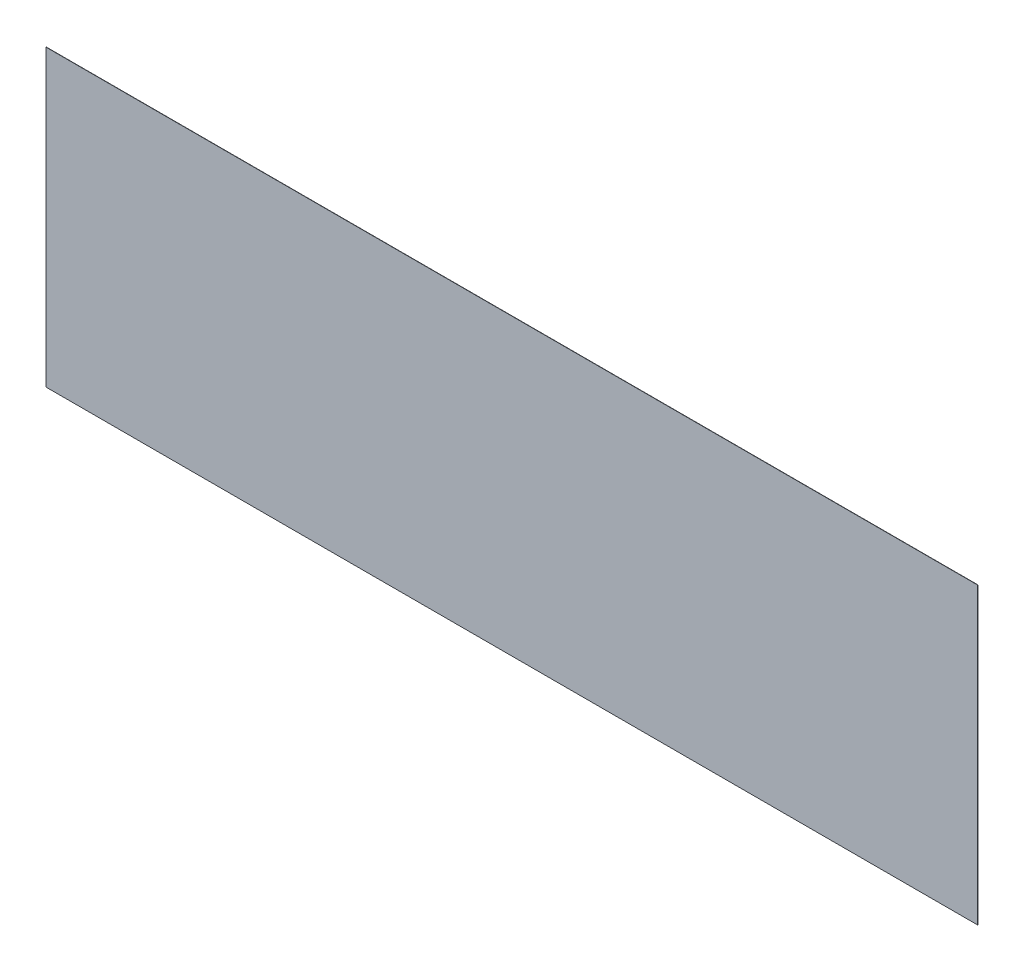
ISO-10303-21;
HEADER;
FILE_DESCRIPTION(('STEP AP214'),'2;1');
FILE_NAME('part.step','',(''),(''),'','','');
FILE_SCHEMA(('AUTOMOTIVE_DESIGN { 1 0 10303 214 1 1 1 1 }'));
ENDSEC;
DATA;
#1=APPLICATION_CONTEXT('core data for automotive mechanical design processes');
#2=APPLICATION_PROTOCOL_DEFINITION('international standard','automotive_design',2000,#1);
#3=PRODUCT_CONTEXT('',#1,'mechanical');
#4=PRODUCT('Part','Part','',(#3));
#5=PRODUCT_RELATED_PRODUCT_CATEGORY('part','',(#4));
#6=PRODUCT_DEFINITION_FORMATION('','',#4);
#7=PRODUCT_DEFINITION_CONTEXT('part definition',#1,'design');
#8=PRODUCT_DEFINITION('design','',#6,#7);
#9=PRODUCT_DEFINITION_SHAPE('','',#8);
#10=(LENGTH_UNIT() NAMED_UNIT(*) SI_UNIT(.MILLI.,.METRE.));
#11=(NAMED_UNIT(*) PLANE_ANGLE_UNIT() SI_UNIT($,.RADIAN.));
#12=(NAMED_UNIT(*) SI_UNIT($,.STERADIAN.) SOLID_ANGLE_UNIT());
#13=UNCERTAINTY_MEASURE_WITH_UNIT(LENGTH_MEASURE(1.E-05),#10,'distance_accuracy_value','');
#14=(GEOMETRIC_REPRESENTATION_CONTEXT(3) GLOBAL_UNCERTAINTY_ASSIGNED_CONTEXT((#13)) GLOBAL_UNIT_ASSIGNED_CONTEXT((#10,
#11,#12)) REPRESENTATION_CONTEXT('',''));
#15=CARTESIAN_POINT('',(0.,0.,0.));
#16=DIRECTION('',(0.,0.,1.));
#17=DIRECTION('',(1.,0.,0.));
#18=AXIS2_PLACEMENT_3D('',#15,#16,#17);
#19=CARTESIAN_POINT('',(-125.,-60.,151.4032));
#20=DIRECTION('',(1.,0.,0.));
#21=DIRECTION('',(0.,1.,0.));
#22=AXIS2_PLACEMENT_3D('',#19,#20,#21);
#23=PLANE('',#22);
#24=DIRECTION('',(0.,-1.,0.));
#25=VECTOR('',#24,1.);
#26=CARTESIAN_POINT('',(-125.,-60.,151.4032));
#27=LINE('',#26,#25);
#28=CARTESIAN_POINT('',(-125.,19.0000000000022,151.4032));
#29=VERTEX_POINT('',#28);
#30=CARTESIAN_POINT('',(-125.,-60.,151.4032));
#31=VERTEX_POINT('',#30);
#32=EDGE_CURVE('E94',#29,#31,#27,.T.);
#33=ORIENTED_EDGE('',*,*,#32,.F.);
#34=DIRECTION('',(0.,0.,1.));
#35=VECTOR('',#34,1.);
#36=CARTESIAN_POINT('',(-125.,19.0000000000022,141.4032));
#37=LINE('',#36,#35);
#38=CARTESIAN_POINT('',(-125.,19.0000000000022,151.327));
#39=VERTEX_POINT('',#38);
#40=EDGE_CURVE('E101',#39,#29,#37,.T.);
#41=ORIENTED_EDGE('',*,*,#40,.F.);
#42=DIRECTION('',(0.,-1.,0.));
#43=VECTOR('',#42,1.);
#44=CARTESIAN_POINT('',(-125.,-60.,151.327));
#45=LINE('',#44,#43);
#46=CARTESIAN_POINT('',(-125.,-60.,151.327));
#47=VERTEX_POINT('',#46);
#48=EDGE_CURVE('E86',#39,#47,#45,.T.);
#49=ORIENTED_EDGE('',*,*,#48,.T.);
#50=DIRECTION('',(0.,0.,-1.));
#51=VECTOR('',#50,1.);
#52=CARTESIAN_POINT('',(-125.,-60.,151.4032));
#53=LINE('',#52,#51);
#54=EDGE_CURVE('E48',#31,#47,#53,.T.);
#55=ORIENTED_EDGE('',*,*,#54,.F.);
#56=EDGE_LOOP('',(#33,#41,#49,#55));
#57=FACE_BOUND('',#56,.T.);
#58=ADVANCED_FACE('F41',(#57),#23,.F.);
#59=CARTESIAN_POINT('',(-125.,-60.,151.4032));
#60=DIRECTION('',(0.,1.,0.));
#61=DIRECTION('',(0.,0.,1.));
#62=AXIS2_PLACEMENT_3D('',#59,#60,#61);
#63=PLANE('',#62);
#64=DIRECTION('',(1.,0.,0.));
#65=VECTOR('',#64,1.);
#66=CARTESIAN_POINT('',(-125.,-60.,151.327));
#67=LINE('',#66,#65);
#68=CARTESIAN_POINT('',(125.,-60.,151.327));
#69=VERTEX_POINT('',#68);
#70=EDGE_CURVE('E76',#47,#69,#67,.T.);
#71=ORIENTED_EDGE('',*,*,#70,.T.);
#72=DIRECTION('',(0.,0.,-1.));
#73=VECTOR('',#72,1.);
#74=CARTESIAN_POINT('',(125.,-60.,151.4032));
#75=LINE('',#74,#73);
#76=CARTESIAN_POINT('',(125.,-60.,151.4032));
#77=VERTEX_POINT('',#76);
#78=EDGE_CURVE('E79',#77,#69,#75,.T.);
#79=ORIENTED_EDGE('',*,*,#78,.F.);
#80=DIRECTION('',(1.,0.,0.));
#81=VECTOR('',#80,1.);
#82=CARTESIAN_POINT('',(-125.,-60.,151.4032));
#83=LINE('',#82,#81);
#84=EDGE_CURVE('E63',#31,#77,#83,.T.);
#85=ORIENTED_EDGE('',*,*,#84,.F.);
#86=ORIENTED_EDGE('',*,*,#54,.T.);
#87=EDGE_LOOP('',(#71,#79,#85,#86));
#88=FACE_BOUND('',#87,.T.);
#89=ADVANCED_FACE('F78',(#88),#63,.F.);
#90=CARTESIAN_POINT('',(125.,-60.,151.4032));
#91=DIRECTION('',(-1.,0.,0.));
#92=DIRECTION('',(0.,-1.,0.));
#93=AXIS2_PLACEMENT_3D('',#90,#91,#92);
#94=PLANE('',#93);
#95=DIRECTION('',(0.,1.,0.));
#96=VECTOR('',#95,1.);
#97=CARTESIAN_POINT('',(125.,-60.,151.327));
#98=LINE('',#97,#96);
#99=CARTESIAN_POINT('',(125.,19.0000000000022,151.327));
#100=VERTEX_POINT('',#99);
#101=EDGE_CURVE('E85',#69,#100,#98,.T.);
#102=ORIENTED_EDGE('',*,*,#101,.T.);
#103=DIRECTION('',(0.,0.,1.));
#104=VECTOR('',#103,1.);
#105=CARTESIAN_POINT('',(125.,19.0000000000022,141.4032));
#106=LINE('',#105,#104);
#107=CARTESIAN_POINT('',(125.,19.0000000000022,151.4032));
#108=VERTEX_POINT('',#107);
#109=EDGE_CURVE('E54',#100,#108,#106,.T.);
#110=ORIENTED_EDGE('',*,*,#109,.T.);
#111=DIRECTION('',(0.,1.,0.));
#112=VECTOR('',#111,1.);
#113=CARTESIAN_POINT('',(125.,-60.,151.4032));
#114=LINE('',#113,#112);
#115=EDGE_CURVE('E91',#77,#108,#114,.T.);
#116=ORIENTED_EDGE('',*,*,#115,.F.);
#117=ORIENTED_EDGE('',*,*,#78,.T.);
#118=EDGE_LOOP('',(#102,#110,#116,#117));
#119=FACE_BOUND('',#118,.T.);
#120=ADVANCED_FACE('F90',(#119),#94,.F.);
#121=CARTESIAN_POINT('',(0.,0.,151.4032));
#122=DIRECTION('',(0.,0.,-1.));
#123=DIRECTION('',(-1.,0.,0.));
#124=AXIS2_PLACEMENT_3D('',#121,#122,#123);
#125=PLANE('',#124);
#126=ORIENTED_EDGE('',*,*,#115,.T.);
#127=DIRECTION('',(1.,0.,0.));
#128=VECTOR('',#127,1.);
#129=CARTESIAN_POINT('',(-125.,19.0000000000022,151.4032));
#130=LINE('',#129,#128);
#131=EDGE_CURVE('E104',#29,#108,#130,.T.);
#132=ORIENTED_EDGE('',*,*,#131,.F.);
#133=ORIENTED_EDGE('',*,*,#32,.T.);
#134=ORIENTED_EDGE('',*,*,#84,.T.);
#135=EDGE_LOOP('',(#126,#132,#133,#134));
#136=FACE_BOUND('',#135,.T.);
#137=ADVANCED_FACE('F113',(#136),#125,.F.);
#138=CARTESIAN_POINT('',(0.,0.,151.327));
#139=DIRECTION('',(0.,0.,-1.));
#140=DIRECTION('',(-1.,0.,0.));
#141=AXIS2_PLACEMENT_3D('',#138,#139,#140);
#142=PLANE('',#141);
#143=DIRECTION('',(-1.,0.,0.));
#144=VECTOR('',#143,1.);
#145=CARTESIAN_POINT('',(0.,19.0000000000022,151.327));
#146=LINE('',#145,#144);
#147=EDGE_CURVE('E11',#100,#39,#146,.T.);
#148=ORIENTED_EDGE('',*,*,#147,.F.);
#149=ORIENTED_EDGE('',*,*,#101,.F.);
#150=ORIENTED_EDGE('',*,*,#70,.F.);
#151=ORIENTED_EDGE('',*,*,#48,.F.);
#152=EDGE_LOOP('',(#148,#149,#150,#151));
#153=FACE_BOUND('',#152,.T.);
#154=ADVANCED_FACE('F93',(#153),#142,.T.);
#155=CARTESIAN_POINT('',(-125.,19.0000000000022,141.4032));
#156=DIRECTION('',(0.,-1.,0.));
#157=DIRECTION('',(0.,0.,-1.));
#158=AXIS2_PLACEMENT_3D('',#155,#156,#157);
#159=PLANE('',#158);
#160=ORIENTED_EDGE('',*,*,#147,.T.);
#161=ORIENTED_EDGE('',*,*,#40,.T.);
#162=ORIENTED_EDGE('',*,*,#131,.T.);
#163=ORIENTED_EDGE('',*,*,#109,.F.);
#164=EDGE_LOOP('',(#160,#161,#162,#163));
#165=FACE_BOUND('',#164,.T.);
#166=ADVANCED_FACE('F108',(#165),#159,.F.);
#167=CLOSED_SHELL('',(#58,#89,#120,#137,#154,#166));
#168=MANIFOLD_SOLID_BREP('B2',#167);
#169=ADVANCED_BREP_SHAPE_REPRESENTATION('',(#18,#168),#14);
#170=SHAPE_DEFINITION_REPRESENTATION(#9,#169);
ENDSEC;
END-ISO-10303-21;
